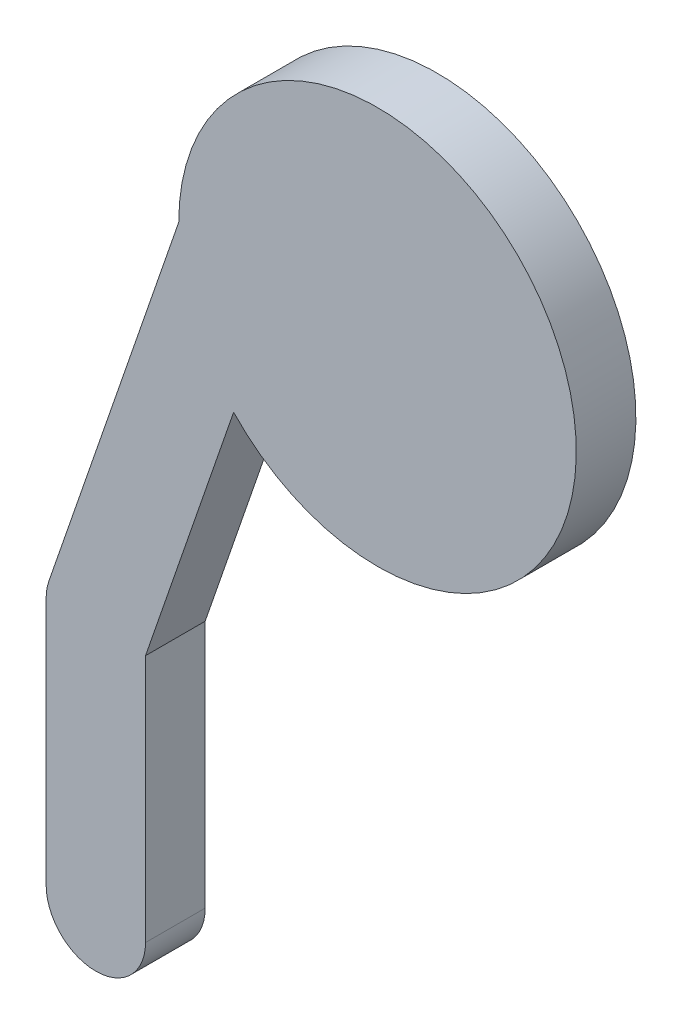
ISO-10303-21;
HEADER;
FILE_DESCRIPTION(('STEP AP214'),'2;1');
FILE_NAME('part.step','',(''),(''),'','','');
FILE_SCHEMA(('AUTOMOTIVE_DESIGN { 1 0 10303 214 1 1 1 1 }'));
ENDSEC;
DATA;
#1=APPLICATION_CONTEXT('core data for automotive mechanical design processes');
#2=APPLICATION_PROTOCOL_DEFINITION('international standard','automotive_design',2000,#1);
#3=PRODUCT_CONTEXT('',#1,'mechanical');
#4=PRODUCT('Part','Part','',(#3));
#5=PRODUCT_RELATED_PRODUCT_CATEGORY('part','',(#4));
#6=PRODUCT_DEFINITION_FORMATION('','',#4);
#7=PRODUCT_DEFINITION_CONTEXT('part definition',#1,'design');
#8=PRODUCT_DEFINITION('design','',#6,#7);
#9=PRODUCT_DEFINITION_SHAPE('','',#8);
#10=(LENGTH_UNIT() NAMED_UNIT(*) SI_UNIT(.MILLI.,.METRE.));
#11=(NAMED_UNIT(*) PLANE_ANGLE_UNIT() SI_UNIT($,.RADIAN.));
#12=(NAMED_UNIT(*) SI_UNIT($,.STERADIAN.) SOLID_ANGLE_UNIT());
#13=UNCERTAINTY_MEASURE_WITH_UNIT(LENGTH_MEASURE(1.E-05),#10,'distance_accuracy_value','');
#14=(GEOMETRIC_REPRESENTATION_CONTEXT(3) GLOBAL_UNCERTAINTY_ASSIGNED_CONTEXT((#13)) GLOBAL_UNIT_ASSIGNED_CONTEXT((#10,
#11,#12)) REPRESENTATION_CONTEXT('',''));
#15=CARTESIAN_POINT('',(0.,0.,0.));
#16=DIRECTION('',(0.,0.,1.));
#17=DIRECTION('',(1.,0.,0.));
#18=AXIS2_PLACEMENT_3D('',#15,#16,#17);
#19=CARTESIAN_POINT('',(28.3419273681511,64.4387150878993,6.));
#20=DIRECTION('',(0.,0.,-1.));
#21=DIRECTION('',(-1.,0.,0.));
#22=AXIS2_PLACEMENT_3D('',#19,#20,#21);
#23=CYLINDRICAL_SURFACE('',#22,20.);
#24=CARTESIAN_POINT('',(28.3419273681511,64.4387150878993,0.));
#25=DIRECTION('',(0.,0.,1.));
#26=DIRECTION('',(1.,0.,0.));
#27=AXIS2_PLACEMENT_3D('',#24,#25,#26);
#28=CIRCLE('',#27,20.);
#29=CARTESIAN_POINT('',(13.8631085915296,50.6414759860444,0.));
#30=VERTEX_POINT('',#29);
#31=CARTESIAN_POINT('',(8.34192736815112,64.4387150878993,0.));
#32=VERTEX_POINT('',#31);
#33=EDGE_CURVE('E131',#30,#32,#28,.T.);
#34=ORIENTED_EDGE('',*,*,#33,.T.);
#35=DIRECTION('',(0.,0.,-1.));
#36=VECTOR('',#35,1.);
#37=CARTESIAN_POINT('',(8.34192736815112,64.4387150878993,6.));
#38=LINE('',#37,#36);
#39=CARTESIAN_POINT('',(8.34192736815112,64.4387150878993,6.));
#40=VERTEX_POINT('',#39);
#41=EDGE_CURVE('E11',#40,#32,#38,.T.);
#42=ORIENTED_EDGE('',*,*,#41,.F.);
#43=CARTESIAN_POINT('',(28.3419273681511,64.4387150878993,6.));
#44=DIRECTION('',(0.,0.,1.));
#45=DIRECTION('',(1.,0.,0.));
#46=AXIS2_PLACEMENT_3D('',#43,#44,#45);
#47=CIRCLE('',#46,20.);
#48=CARTESIAN_POINT('',(13.8631085915296,50.6414759860444,6.));
#49=VERTEX_POINT('',#48);
#50=EDGE_CURVE('E144',#49,#40,#47,.T.);
#51=ORIENTED_EDGE('',*,*,#50,.F.);
#52=DIRECTION('',(0.,0.,-1.));
#53=VECTOR('',#52,1.);
#54=CARTESIAN_POINT('',(13.8631085915296,50.6414759860444,6.));
#55=LINE('',#54,#53);
#56=EDGE_CURVE('E127',#49,#30,#55,.T.);
#57=ORIENTED_EDGE('',*,*,#56,.T.);
#58=EDGE_LOOP('',(#34,#42,#51,#57));
#59=FACE_BOUND('',#58,.T.);
#60=ADVANCED_FACE('F41',(#59),#23,.T.);
#61=CARTESIAN_POINT('',(8.34192736815112,64.4387150878993,6.));
#62=DIRECTION('',(0.945131671800132,-0.326689643178794,0.));
#63=DIRECTION('',(0.326689643178794,0.945131671800132,0.));
#64=AXIS2_PLACEMENT_3D('',#61,#62,#63);
#65=PLANE('',#64);
#66=DIRECTION('',(-0.326689643178794,-0.945131671800132,0.));
#67=VECTOR('',#66,1.);
#68=CARTESIAN_POINT('',(8.34192736815112,64.4387150878993,0.));
#69=LINE('',#68,#67);
#70=CARTESIAN_POINT('',(-4.72565835900066,26.633448215894,0.));
#71=VERTEX_POINT('',#70);
#72=EDGE_CURVE('E134',#32,#71,#69,.T.);
#73=ORIENTED_EDGE('',*,*,#72,.T.);
#74=DIRECTION('',(0.,0.,-1.));
#75=VECTOR('',#74,1.);
#76=CARTESIAN_POINT('',(-4.72565835900066,26.633448215894,6.));
#77=LINE('',#76,#75);
#78=CARTESIAN_POINT('',(-4.72565835900066,26.633448215894,6.));
#79=VERTEX_POINT('',#78);
#80=EDGE_CURVE('E49',#79,#71,#77,.T.);
#81=ORIENTED_EDGE('',*,*,#80,.F.);
#82=DIRECTION('',(-0.326689643178794,-0.945131671800132,0.));
#83=VECTOR('',#82,1.);
#84=CARTESIAN_POINT('',(8.34192736815112,64.4387150878993,6.));
#85=LINE('',#84,#83);
#86=EDGE_CURVE('E97',#40,#79,#85,.T.);
#87=ORIENTED_EDGE('',*,*,#86,.F.);
#88=ORIENTED_EDGE('',*,*,#41,.T.);
#89=EDGE_LOOP('',(#73,#81,#87,#88));
#90=FACE_BOUND('',#89,.T.);
#91=ADVANCED_FACE('F190',(#90),#65,.F.);
#92=CARTESIAN_POINT('',(0.,25.,6.));
#93=DIRECTION('',(0.,0.,-1.));
#94=DIRECTION('',(-1.,0.,0.));
#95=AXIS2_PLACEMENT_3D('',#92,#93,#94);
#96=CYLINDRICAL_SURFACE('',#95,5.);
#97=CARTESIAN_POINT('',(0.,25.,0.));
#98=DIRECTION('',(0.,0.,1.));
#99=DIRECTION('',(1.,0.,0.));
#100=AXIS2_PLACEMENT_3D('',#97,#98,#99);
#101=CIRCLE('',#100,5.);
#102=CARTESIAN_POINT('',(-5.,25.,0.));
#103=VERTEX_POINT('',#102);
#104=EDGE_CURVE('E137',#71,#103,#101,.T.);
#105=ORIENTED_EDGE('',*,*,#104,.T.);
#106=DIRECTION('',(0.,0.,-1.));
#107=VECTOR('',#106,1.);
#108=CARTESIAN_POINT('',(-5.,25.,6.));
#109=LINE('',#108,#107);
#110=CARTESIAN_POINT('',(-5.,25.,6.));
#111=VERTEX_POINT('',#110);
#112=EDGE_CURVE('E148',#111,#103,#109,.T.);
#113=ORIENTED_EDGE('',*,*,#112,.F.);
#114=CARTESIAN_POINT('',(0.,25.,6.));
#115=DIRECTION('',(0.,0.,1.));
#116=DIRECTION('',(1.,0.,0.));
#117=AXIS2_PLACEMENT_3D('',#114,#115,#116);
#118=CIRCLE('',#117,5.);
#119=EDGE_CURVE('E156',#79,#111,#118,.T.);
#120=ORIENTED_EDGE('',*,*,#119,.F.);
#121=ORIENTED_EDGE('',*,*,#80,.T.);
#122=EDGE_LOOP('',(#105,#113,#120,#121));
#123=FACE_BOUND('',#122,.T.);
#124=ADVANCED_FACE('F154',(#123),#96,.T.);
#125=CARTESIAN_POINT('',(-5.,0.,6.));
#126=DIRECTION('',(1.,0.,0.));
#127=DIRECTION('',(0.,0.,-1.));
#128=AXIS2_PLACEMENT_3D('',#125,#126,#127);
#129=PLANE('',#128);
#130=DIRECTION('',(0.,-1.,0.));
#131=VECTOR('',#130,1.);
#132=CARTESIAN_POINT('',(-5.,0.,0.));
#133=LINE('',#132,#131);
#134=CARTESIAN_POINT('',(-5.,0.,0.));
#135=VERTEX_POINT('',#134);
#136=EDGE_CURVE('E139',#103,#135,#133,.T.);
#137=ORIENTED_EDGE('',*,*,#136,.T.);
#138=DIRECTION('',(0.,0.,-1.));
#139=VECTOR('',#138,1.);
#140=CARTESIAN_POINT('',(-5.,0.,6.));
#141=LINE('',#140,#139);
#142=CARTESIAN_POINT('',(-5.,0.,6.));
#143=VERTEX_POINT('',#142);
#144=EDGE_CURVE('E122',#143,#135,#141,.T.);
#145=ORIENTED_EDGE('',*,*,#144,.F.);
#146=DIRECTION('',(0.,-1.,0.));
#147=VECTOR('',#146,1.);
#148=CARTESIAN_POINT('',(-5.,0.,6.));
#149=LINE('',#148,#147);
#150=EDGE_CURVE('E113',#111,#143,#149,.T.);
#151=ORIENTED_EDGE('',*,*,#150,.F.);
#152=ORIENTED_EDGE('',*,*,#112,.T.);
#153=EDGE_LOOP('',(#137,#145,#151,#152));
#154=FACE_BOUND('',#153,.T.);
#155=ADVANCED_FACE('F162',(#154),#129,.F.);
#156=CARTESIAN_POINT('',(0.,0.,6.));
#157=DIRECTION('',(0.,0.,-1.));
#158=DIRECTION('',(-1.,0.,0.));
#159=AXIS2_PLACEMENT_3D('',#156,#157,#158);
#160=CYLINDRICAL_SURFACE('',#159,5.);
#161=CARTESIAN_POINT('',(0.,0.,0.));
#162=DIRECTION('',(0.,0.,1.));
#163=DIRECTION('',(1.,0.,0.));
#164=AXIS2_PLACEMENT_3D('',#161,#162,#163);
#165=CIRCLE('',#164,5.);
#166=CARTESIAN_POINT('',(5.,0.,0.));
#167=VERTEX_POINT('',#166);
#168=EDGE_CURVE('E121',#135,#167,#165,.T.);
#169=ORIENTED_EDGE('',*,*,#168,.T.);
#170=DIRECTION('',(0.,0.,-1.));
#171=VECTOR('',#170,1.);
#172=CARTESIAN_POINT('',(5.,0.,6.));
#173=LINE('',#172,#171);
#174=CARTESIAN_POINT('',(5.,0.,6.));
#175=VERTEX_POINT('',#174);
#176=EDGE_CURVE('E118',#175,#167,#173,.T.);
#177=ORIENTED_EDGE('',*,*,#176,.F.);
#178=CARTESIAN_POINT('',(0.,0.,6.));
#179=DIRECTION('',(0.,0.,1.));
#180=DIRECTION('',(1.,0.,0.));
#181=AXIS2_PLACEMENT_3D('',#178,#179,#180);
#182=CIRCLE('',#181,5.);
#183=EDGE_CURVE('E107',#143,#175,#182,.T.);
#184=ORIENTED_EDGE('',*,*,#183,.F.);
#185=ORIENTED_EDGE('',*,*,#144,.T.);
#186=EDGE_LOOP('',(#169,#177,#184,#185));
#187=FACE_BOUND('',#186,.T.);
#188=ADVANCED_FACE('F119',(#187),#160,.T.);
#189=CARTESIAN_POINT('',(5.,0.,6.));
#190=DIRECTION('',(-1.,0.,0.));
#191=DIRECTION('',(0.,-1.,0.));
#192=AXIS2_PLACEMENT_3D('',#189,#190,#191);
#193=PLANE('',#192);
#194=DIRECTION('',(0.,1.,0.));
#195=VECTOR('',#194,1.);
#196=CARTESIAN_POINT('',(5.,0.,0.));
#197=LINE('',#196,#195);
#198=CARTESIAN_POINT('',(5.00000000000001,25.,0.));
#199=VERTEX_POINT('',#198);
#200=EDGE_CURVE('E83',#167,#199,#197,.T.);
#201=ORIENTED_EDGE('',*,*,#200,.T.);
#202=DIRECTION('',(0.,0.,-1.));
#203=VECTOR('',#202,1.);
#204=CARTESIAN_POINT('',(5.00000000000001,25.,6.));
#205=LINE('',#204,#203);
#206=CARTESIAN_POINT('',(5.00000000000001,25.,6.));
#207=VERTEX_POINT('',#206);
#208=EDGE_CURVE('E123',#207,#199,#205,.T.);
#209=ORIENTED_EDGE('',*,*,#208,.F.);
#210=DIRECTION('',(0.,1.,0.));
#211=VECTOR('',#210,1.);
#212=CARTESIAN_POINT('',(5.,0.,6.));
#213=LINE('',#212,#211);
#214=EDGE_CURVE('E111',#175,#207,#213,.T.);
#215=ORIENTED_EDGE('',*,*,#214,.F.);
#216=ORIENTED_EDGE('',*,*,#176,.T.);
#217=EDGE_LOOP('',(#201,#209,#215,#216));
#218=FACE_BOUND('',#217,.T.);
#219=ADVANCED_FACE('F125',(#218),#193,.F.);
#220=CARTESIAN_POINT('',(5.00000000000001,25.,6.));
#221=DIRECTION('',(-0.945131671800132,0.326689643178794,0.));
#222=DIRECTION('',(-0.326689643178794,-0.945131671800132,0.));
#223=AXIS2_PLACEMENT_3D('',#220,#221,#222);
#224=PLANE('',#223);
#225=DIRECTION('',(0.326689643178794,0.945131671800132,0.));
#226=VECTOR('',#225,1.);
#227=CARTESIAN_POINT('',(5.00000000000001,25.,0.));
#228=LINE('',#227,#226);
#229=EDGE_CURVE('E89',#199,#30,#228,.T.);
#230=ORIENTED_EDGE('',*,*,#229,.T.);
#231=ORIENTED_EDGE('',*,*,#56,.F.);
#232=DIRECTION('',(0.326689643178794,0.945131671800132,0.));
#233=VECTOR('',#232,1.);
#234=CARTESIAN_POINT('',(5.00000000000001,25.,6.));
#235=LINE('',#234,#233);
#236=EDGE_CURVE('E57',#207,#49,#235,.T.);
#237=ORIENTED_EDGE('',*,*,#236,.F.);
#238=ORIENTED_EDGE('',*,*,#208,.T.);
#239=EDGE_LOOP('',(#230,#231,#237,#238));
#240=FACE_BOUND('',#239,.T.);
#241=ADVANCED_FACE('F186',(#240),#224,.F.);
#242=CARTESIAN_POINT('',(28.3419273681511,64.4387150878993,6.));
#243=DIRECTION('',(0.,0.,1.));
#244=DIRECTION('',(1.,0.,0.));
#245=AXIS2_PLACEMENT_3D('',#242,#243,#244);
#246=PLANE('',#245);
#247=ORIENTED_EDGE('',*,*,#50,.T.);
#248=ORIENTED_EDGE('',*,*,#86,.T.);
#249=ORIENTED_EDGE('',*,*,#119,.T.);
#250=ORIENTED_EDGE('',*,*,#150,.T.);
#251=ORIENTED_EDGE('',*,*,#183,.T.);
#252=ORIENTED_EDGE('',*,*,#214,.T.);
#253=ORIENTED_EDGE('',*,*,#236,.T.);
#254=EDGE_LOOP('',(#247,#248,#249,#250,#251,#252,#253));
#255=FACE_BOUND('',#254,.T.);
#256=ADVANCED_FACE('F109',(#255),#246,.T.);
#257=CARTESIAN_POINT('',(28.3419273681511,64.4387150878993,0.));
#258=DIRECTION('',(0.,0.,1.));
#259=DIRECTION('',(1.,0.,0.));
#260=AXIS2_PLACEMENT_3D('',#257,#258,#259);
#261=PLANE('',#260);
#262=CARTESIAN_POINT('',(0.,0.,0.));
#263=DIRECTION('',(0.,0.,-1.));
#264=DIRECTION('',(-1.,0.,0.));
#265=AXIS2_PLACEMENT_3D('',#262,#263,#264);
#266=CIRCLE('',#265,2.80484848590513);
#267=CARTESIAN_POINT('',(-2.80484848590513,0.,0.));
#268=VERTEX_POINT('',#267);
#269=EDGE_CURVE('E167',#268,#268,#266,.T.);
#270=ORIENTED_EDGE('',*,*,#269,.F.);
#271=EDGE_LOOP('',(#270));
#272=FACE_BOUND('',#271,.T.);
#273=ORIENTED_EDGE('',*,*,#33,.F.);
#274=ORIENTED_EDGE('',*,*,#229,.F.);
#275=ORIENTED_EDGE('',*,*,#200,.F.);
#276=ORIENTED_EDGE('',*,*,#168,.F.);
#277=ORIENTED_EDGE('',*,*,#136,.F.);
#278=ORIENTED_EDGE('',*,*,#104,.F.);
#279=ORIENTED_EDGE('',*,*,#72,.F.);
#280=EDGE_LOOP('',(#273,#274,#275,#276,#277,#278,#279));
#281=FACE_BOUND('',#280,.T.);
#282=ADVANCED_FACE('F160',(#272,#281),#261,.F.);
#283=CARTESIAN_POINT('',(0.,0.,3.));
#284=DIRECTION('',(0.,0.,-1.));
#285=DIRECTION('',(-1.,0.,0.));
#286=AXIS2_PLACEMENT_3D('',#283,#284,#285);
#287=CYLINDRICAL_SURFACE('',#286,2.80484848590513);
#288=CARTESIAN_POINT('',(0.,0.,3.));
#289=DIRECTION('',(0.,0.,-1.));
#290=DIRECTION('',(-1.,0.,0.));
#291=AXIS2_PLACEMENT_3D('',#288,#289,#290);
#292=CIRCLE('',#291,2.80484848590513);
#293=CARTESIAN_POINT('',(-2.80484848590513,0.,3.));
#294=VERTEX_POINT('',#293);
#295=EDGE_CURVE('E135',#294,#294,#292,.T.);
#296=ORIENTED_EDGE('',*,*,#295,.F.);
#297=EDGE_LOOP('',(#296));
#298=FACE_BOUND('',#297,.T.);
#299=ORIENTED_EDGE('',*,*,#269,.T.);
#300=EDGE_LOOP('',(#299));
#301=FACE_BOUND('',#300,.T.);
#302=ADVANCED_FACE('F175',(#298,#301),#287,.F.);
#303=CARTESIAN_POINT('',(0.,0.,3.));
#304=DIRECTION('',(0.,0.,-1.));
#305=DIRECTION('',(-1.,0.,0.));
#306=AXIS2_PLACEMENT_3D('',#303,#304,#305);
#307=PLANE('',#306);
#308=ORIENTED_EDGE('',*,*,#295,.T.);
#309=EDGE_LOOP('',(#308));
#310=FACE_BOUND('',#309,.T.);
#311=ADVANCED_FACE('F173',(#310),#307,.T.);
#312=CLOSED_SHELL('',(#60,#91,#124,#155,#188,#219,#241,#256,#282,#302,#311));
#313=MANIFOLD_SOLID_BREP('B2',#312);
#314=ADVANCED_BREP_SHAPE_REPRESENTATION('',(#18,#313),#14);
#315=SHAPE_DEFINITION_REPRESENTATION(#9,#314);
ENDSEC;
END-ISO-10303-21;
